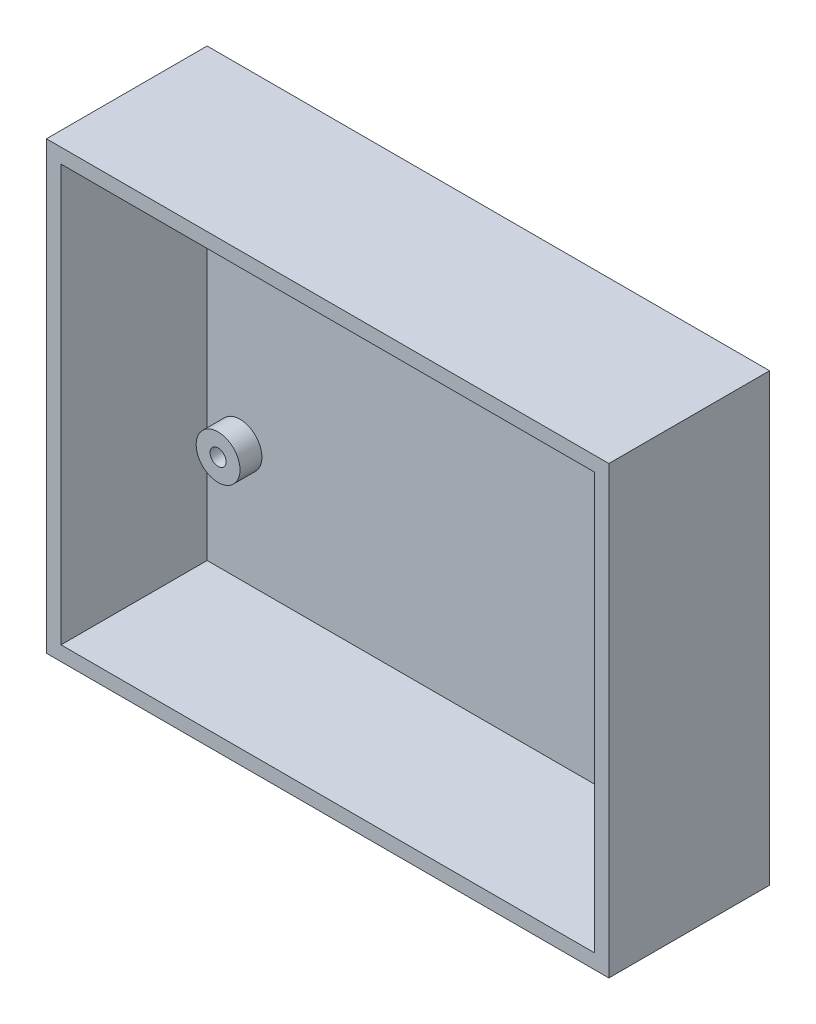
ISO-10303-21;
HEADER;
FILE_DESCRIPTION(('STEP AP214'),'2;1');
FILE_NAME('part.step','',(''),(''),'','','');
FILE_SCHEMA(('AUTOMOTIVE_DESIGN { 1 0 10303 214 1 1 1 1 }'));
ENDSEC;
DATA;
#1=APPLICATION_CONTEXT('core data for automotive mechanical design processes');
#2=APPLICATION_PROTOCOL_DEFINITION('international standard','automotive_design',2000,#1);
#3=PRODUCT_CONTEXT('',#1,'mechanical');
#4=PRODUCT('Part','Part','',(#3));
#5=PRODUCT_RELATED_PRODUCT_CATEGORY('part','',(#4));
#6=PRODUCT_DEFINITION_FORMATION('','',#4);
#7=PRODUCT_DEFINITION_CONTEXT('part definition',#1,'design');
#8=PRODUCT_DEFINITION('design','',#6,#7);
#9=PRODUCT_DEFINITION_SHAPE('','',#8);
#10=(LENGTH_UNIT() NAMED_UNIT(*) SI_UNIT(.MILLI.,.METRE.));
#11=(NAMED_UNIT(*) PLANE_ANGLE_UNIT() SI_UNIT($,.RADIAN.));
#12=(NAMED_UNIT(*) SI_UNIT($,.STERADIAN.) SOLID_ANGLE_UNIT());
#13=UNCERTAINTY_MEASURE_WITH_UNIT(LENGTH_MEASURE(1.E-05),#10,'distance_accuracy_value','');
#14=(GEOMETRIC_REPRESENTATION_CONTEXT(3) GLOBAL_UNCERTAINTY_ASSIGNED_CONTEXT((#13)) GLOBAL_UNIT_ASSIGNED_CONTEXT((#10,
#11,#12)) REPRESENTATION_CONTEXT('',''));
#15=CARTESIAN_POINT('',(0.,0.,0.));
#16=DIRECTION('',(0.,0.,1.));
#17=DIRECTION('',(1.,0.,0.));
#18=AXIS2_PLACEMENT_3D('',#15,#16,#17);
#19=CARTESIAN_POINT('',(2.,2.,22.));
#20=DIRECTION('',(1.,0.,0.));
#21=DIRECTION('',(0.,0.,-1.));
#22=AXIS2_PLACEMENT_3D('',#19,#20,#21);
#23=PLANE('',#22);
#24=DIRECTION('',(0.,0.,-1.));
#25=VECTOR('',#24,1.);
#26=CARTESIAN_POINT('',(2.,2.,22.));
#27=LINE('',#26,#25);
#28=CARTESIAN_POINT('',(2.,2.,22.));
#29=VERTEX_POINT('',#28);
#30=CARTESIAN_POINT('',(2.,2.,2.));
#31=VERTEX_POINT('',#30);
#32=EDGE_CURVE('E118',#29,#31,#27,.T.);
#33=ORIENTED_EDGE('',*,*,#32,.T.);
#34=DIRECTION('',(0.,1.,0.));
#35=VECTOR('',#34,1.);
#36=CARTESIAN_POINT('',(2.,2.,2.));
#37=LINE('',#36,#35);
#38=CARTESIAN_POINT('',(2.,59.,2.));
#39=VERTEX_POINT('',#38);
#40=EDGE_CURVE('E106',#31,#39,#37,.T.);
#41=ORIENTED_EDGE('',*,*,#40,.T.);
#42=DIRECTION('',(0.,0.,-1.));
#43=VECTOR('',#42,1.);
#44=CARTESIAN_POINT('',(2.,59.,22.));
#45=LINE('',#44,#43);
#46=CARTESIAN_POINT('',(2.,59.,22.));
#47=VERTEX_POINT('',#46);
#48=EDGE_CURVE('E115',#47,#39,#45,.T.);
#49=ORIENTED_EDGE('',*,*,#48,.F.);
#50=DIRECTION('',(0.,-1.,0.));
#51=VECTOR('',#50,1.);
#52=CARTESIAN_POINT('',(2.,2.,22.));
#53=LINE('',#52,#51);
#54=EDGE_CURVE('E119',#47,#29,#53,.T.);
#55=ORIENTED_EDGE('',*,*,#54,.T.);
#56=EDGE_LOOP('',(#33,#41,#49,#55));
#57=FACE_BOUND('',#56,.T.);
#58=ADVANCED_FACE('F39',(#57),#23,.T.);
#59=CARTESIAN_POINT('',(2.,2.,22.));
#60=DIRECTION('',(0.,1.,0.));
#61=DIRECTION('',(0.,0.,1.));
#62=AXIS2_PLACEMENT_3D('',#59,#60,#61);
#63=PLANE('',#62);
#64=DIRECTION('',(0.,0.,-1.));
#65=VECTOR('',#64,1.);
#66=CARTESIAN_POINT('',(75.,2.,22.));
#67=LINE('',#66,#65);
#68=CARTESIAN_POINT('',(75.,2.,22.));
#69=VERTEX_POINT('',#68);
#70=CARTESIAN_POINT('',(75.,2.,2.));
#71=VERTEX_POINT('',#70);
#72=EDGE_CURVE('E126',#69,#71,#67,.T.);
#73=ORIENTED_EDGE('',*,*,#72,.T.);
#74=DIRECTION('',(-1.,0.,0.));
#75=VECTOR('',#74,1.);
#76=CARTESIAN_POINT('',(2.,2.,2.));
#77=LINE('',#76,#75);
#78=EDGE_CURVE('E120',#71,#31,#77,.T.);
#79=ORIENTED_EDGE('',*,*,#78,.T.);
#80=ORIENTED_EDGE('',*,*,#32,.F.);
#81=DIRECTION('',(1.,0.,0.));
#82=VECTOR('',#81,1.);
#83=CARTESIAN_POINT('',(2.,2.,22.));
#84=LINE('',#83,#82);
#85=EDGE_CURVE('E203',#29,#69,#84,.T.);
#86=ORIENTED_EDGE('',*,*,#85,.T.);
#87=EDGE_LOOP('',(#73,#79,#80,#86));
#88=FACE_BOUND('',#87,.T.);
#89=ADVANCED_FACE('F212',(#88),#63,.T.);
#90=CARTESIAN_POINT('',(75.,2.,22.));
#91=DIRECTION('',(-1.,0.,0.));
#92=DIRECTION('',(0.,0.,1.));
#93=AXIS2_PLACEMENT_3D('',#90,#91,#92);
#94=PLANE('',#93);
#95=DIRECTION('',(0.,0.,-1.));
#96=VECTOR('',#95,1.);
#97=CARTESIAN_POINT('',(75.,59.,22.));
#98=LINE('',#97,#96);
#99=CARTESIAN_POINT('',(75.,59.,22.));
#100=VERTEX_POINT('',#99);
#101=CARTESIAN_POINT('',(75.,59.,2.));
#102=VERTEX_POINT('',#101);
#103=EDGE_CURVE('E63',#100,#102,#98,.T.);
#104=ORIENTED_EDGE('',*,*,#103,.T.);
#105=DIRECTION('',(0.,-1.,0.));
#106=VECTOR('',#105,1.);
#107=CARTESIAN_POINT('',(75.,2.,2.));
#108=LINE('',#107,#106);
#109=EDGE_CURVE('E56',#102,#71,#108,.T.);
#110=ORIENTED_EDGE('',*,*,#109,.T.);
#111=ORIENTED_EDGE('',*,*,#72,.F.);
#112=DIRECTION('',(0.,1.,0.));
#113=VECTOR('',#112,1.);
#114=CARTESIAN_POINT('',(75.,2.,22.));
#115=LINE('',#114,#113);
#116=EDGE_CURVE('E128',#69,#100,#115,.T.);
#117=ORIENTED_EDGE('',*,*,#116,.T.);
#118=EDGE_LOOP('',(#104,#110,#111,#117));
#119=FACE_BOUND('',#118,.T.);
#120=ADVANCED_FACE('F207',(#119),#94,.T.);
#121=CARTESIAN_POINT('',(2.,59.,22.));
#122=DIRECTION('',(0.,-1.,0.));
#123=DIRECTION('',(0.,0.,-1.));
#124=AXIS2_PLACEMENT_3D('',#121,#122,#123);
#125=PLANE('',#124);
#126=ORIENTED_EDGE('',*,*,#48,.T.);
#127=DIRECTION('',(1.,0.,0.));
#128=VECTOR('',#127,1.);
#129=CARTESIAN_POINT('',(2.,59.,2.));
#130=LINE('',#129,#128);
#131=EDGE_CURVE('E103',#39,#102,#130,.T.);
#132=ORIENTED_EDGE('',*,*,#131,.T.);
#133=ORIENTED_EDGE('',*,*,#103,.F.);
#134=DIRECTION('',(-1.,0.,0.));
#135=VECTOR('',#134,1.);
#136=CARTESIAN_POINT('',(2.,59.,22.));
#137=LINE('',#136,#135);
#138=EDGE_CURVE('E124',#100,#47,#137,.T.);
#139=ORIENTED_EDGE('',*,*,#138,.T.);
#140=EDGE_LOOP('',(#126,#132,#133,#139));
#141=FACE_BOUND('',#140,.T.);
#142=ADVANCED_FACE('F122',(#141),#125,.T.);
#143=CARTESIAN_POINT('',(0.,0.,22.));
#144=DIRECTION('',(0.,0.,-1.));
#145=DIRECTION('',(-1.,0.,0.));
#146=AXIS2_PLACEMENT_3D('',#143,#144,#145);
#147=PLANE('',#146);
#148=DIRECTION('',(0.,-1.,0.));
#149=VECTOR('',#148,1.);
#150=CARTESIAN_POINT('',(0.,0.,22.));
#151=LINE('',#150,#149);
#152=CARTESIAN_POINT('',(0.,61.,22.));
#153=VERTEX_POINT('',#152);
#154=CARTESIAN_POINT('',(0.,0.,22.));
#155=VERTEX_POINT('',#154);
#156=EDGE_CURVE('E136',#153,#155,#151,.T.);
#157=ORIENTED_EDGE('',*,*,#156,.T.);
#158=DIRECTION('',(1.,0.,0.));
#159=VECTOR('',#158,1.);
#160=CARTESIAN_POINT('',(0.,0.,22.));
#161=LINE('',#160,#159);
#162=CARTESIAN_POINT('',(77.,0.,22.));
#163=VERTEX_POINT('',#162);
#164=EDGE_CURVE('E139',#155,#163,#161,.T.);
#165=ORIENTED_EDGE('',*,*,#164,.T.);
#166=DIRECTION('',(0.,1.,0.));
#167=VECTOR('',#166,1.);
#168=CARTESIAN_POINT('',(77.,0.,22.));
#169=LINE('',#168,#167);
#170=CARTESIAN_POINT('',(77.,61.,22.));
#171=VERTEX_POINT('',#170);
#172=EDGE_CURVE('E142',#163,#171,#169,.T.);
#173=ORIENTED_EDGE('',*,*,#172,.T.);
#174=DIRECTION('',(-1.,0.,0.));
#175=VECTOR('',#174,1.);
#176=CARTESIAN_POINT('',(0.,61.,22.));
#177=LINE('',#176,#175);
#178=EDGE_CURVE('E144',#171,#153,#177,.T.);
#179=ORIENTED_EDGE('',*,*,#178,.T.);
#180=EDGE_LOOP('',(#157,#165,#173,#179));
#181=FACE_BOUND('',#180,.T.);
#182=ORIENTED_EDGE('',*,*,#54,.F.);
#183=ORIENTED_EDGE('',*,*,#138,.F.);
#184=ORIENTED_EDGE('',*,*,#116,.F.);
#185=ORIENTED_EDGE('',*,*,#85,.F.);
#186=EDGE_LOOP('',(#182,#183,#184,#185));
#187=FACE_BOUND('',#186,.T.);
#188=ADVANCED_FACE('F210',(#181,#187),#147,.F.);
#189=CARTESIAN_POINT('',(0.,0.,0.));
#190=DIRECTION('',(0.,0.,-1.));
#191=DIRECTION('',(-1.,0.,0.));
#192=AXIS2_PLACEMENT_3D('',#189,#190,#191);
#193=PLANE('',#192);
#194=CARTESIAN_POINT('',(70.5,18.,0.));
#195=DIRECTION('',(0.,0.,1.));
#196=DIRECTION('',(1.,0.,0.));
#197=AXIS2_PLACEMENT_3D('',#194,#195,#196);
#198=CIRCLE('',#197,1.10000000000001);
#199=CARTESIAN_POINT('',(71.6,18.,0.));
#200=VERTEX_POINT('',#199);
#201=EDGE_CURVE('E493',#200,#200,#198,.T.);
#202=ORIENTED_EDGE('',*,*,#201,.T.);
#203=EDGE_LOOP('',(#202));
#204=FACE_BOUND('',#203,.T.);
#205=CARTESIAN_POINT('',(6.5,54.,0.));
#206=DIRECTION('',(0.,0.,1.));
#207=DIRECTION('',(1.,0.,0.));
#208=AXIS2_PLACEMENT_3D('',#205,#206,#207);
#209=CIRCLE('',#208,1.1);
#210=CARTESIAN_POINT('',(7.6,54.,0.));
#211=VERTEX_POINT('',#210);
#212=EDGE_CURVE('E495',#211,#211,#209,.T.);
#213=ORIENTED_EDGE('',*,*,#212,.T.);
#214=EDGE_LOOP('',(#213));
#215=FACE_BOUND('',#214,.T.);
#216=CARTESIAN_POINT('',(70.5,54.,0.));
#217=DIRECTION('',(0.,0.,1.));
#218=DIRECTION('',(1.,0.,0.));
#219=AXIS2_PLACEMENT_3D('',#216,#217,#218);
#220=CIRCLE('',#219,1.10000000000001);
#221=CARTESIAN_POINT('',(71.6,54.,0.));
#222=VERTEX_POINT('',#221);
#223=EDGE_CURVE('E499',#222,#222,#220,.T.);
#224=ORIENTED_EDGE('',*,*,#223,.T.);
#225=EDGE_LOOP('',(#224));
#226=FACE_BOUND('',#225,.T.);
#227=CARTESIAN_POINT('',(6.5,18.,0.));
#228=DIRECTION('',(0.,0.,1.));
#229=DIRECTION('',(1.,0.,0.));
#230=AXIS2_PLACEMENT_3D('',#227,#228,#229);
#231=CIRCLE('',#230,1.1);
#232=CARTESIAN_POINT('',(7.6,18.,0.));
#233=VERTEX_POINT('',#232);
#234=EDGE_CURVE('E174',#233,#233,#231,.T.);
#235=ORIENTED_EDGE('',*,*,#234,.T.);
#236=EDGE_LOOP('',(#235));
#237=FACE_BOUND('',#236,.T.);
#238=DIRECTION('',(0.,-1.,0.));
#239=VECTOR('',#238,1.);
#240=CARTESIAN_POINT('',(0.,0.,0.));
#241=LINE('',#240,#239);
#242=CARTESIAN_POINT('',(0.,61.,0.));
#243=VERTEX_POINT('',#242);
#244=CARTESIAN_POINT('',(0.,0.,0.));
#245=VERTEX_POINT('',#244);
#246=EDGE_CURVE('E135',#243,#245,#241,.T.);
#247=ORIENTED_EDGE('',*,*,#246,.F.);
#248=DIRECTION('',(-1.,0.,0.));
#249=VECTOR('',#248,1.);
#250=CARTESIAN_POINT('',(0.,61.,0.));
#251=LINE('',#250,#249);
#252=CARTESIAN_POINT('',(77.,61.,0.));
#253=VERTEX_POINT('',#252);
#254=EDGE_CURVE('E140',#253,#243,#251,.T.);
#255=ORIENTED_EDGE('',*,*,#254,.F.);
#256=DIRECTION('',(0.,1.,0.));
#257=VECTOR('',#256,1.);
#258=CARTESIAN_POINT('',(77.,0.,0.));
#259=LINE('',#258,#257);
#260=CARTESIAN_POINT('',(77.,0.,0.));
#261=VERTEX_POINT('',#260);
#262=EDGE_CURVE('E152',#261,#253,#259,.T.);
#263=ORIENTED_EDGE('',*,*,#262,.F.);
#264=DIRECTION('',(1.,0.,0.));
#265=VECTOR('',#264,1.);
#266=CARTESIAN_POINT('',(0.,0.,0.));
#267=LINE('',#266,#265);
#268=EDGE_CURVE('E149',#245,#261,#267,.T.);
#269=ORIENTED_EDGE('',*,*,#268,.F.);
#270=EDGE_LOOP('',(#247,#255,#263,#269));
#271=FACE_BOUND('',#270,.T.);
#272=ADVANCED_FACE('F225',(#204,#215,#226,#237,#271),#193,.T.);
#273=CARTESIAN_POINT('',(0.,0.,22.));
#274=DIRECTION('',(1.,0.,0.));
#275=DIRECTION('',(0.,0.,-1.));
#276=AXIS2_PLACEMENT_3D('',#273,#274,#275);
#277=PLANE('',#276);
#278=ORIENTED_EDGE('',*,*,#246,.T.);
#279=DIRECTION('',(0.,0.,-1.));
#280=VECTOR('',#279,1.);
#281=CARTESIAN_POINT('',(0.,0.,22.));
#282=LINE('',#281,#280);
#283=EDGE_CURVE('E110',#155,#245,#282,.T.);
#284=ORIENTED_EDGE('',*,*,#283,.F.);
#285=ORIENTED_EDGE('',*,*,#156,.F.);
#286=DIRECTION('',(0.,0.,-1.));
#287=VECTOR('',#286,1.);
#288=CARTESIAN_POINT('',(0.,61.,22.));
#289=LINE('',#288,#287);
#290=EDGE_CURVE('E146',#153,#243,#289,.T.);
#291=ORIENTED_EDGE('',*,*,#290,.T.);
#292=EDGE_LOOP('',(#278,#284,#285,#291));
#293=FACE_BOUND('',#292,.T.);
#294=ADVANCED_FACE('F41',(#293),#277,.F.);
#295=CARTESIAN_POINT('',(0.,0.,22.));
#296=DIRECTION('',(0.,1.,0.));
#297=DIRECTION('',(0.,0.,1.));
#298=AXIS2_PLACEMENT_3D('',#295,#296,#297);
#299=PLANE('',#298);
#300=ORIENTED_EDGE('',*,*,#268,.T.);
#301=DIRECTION('',(0.,0.,-1.));
#302=VECTOR('',#301,1.);
#303=CARTESIAN_POINT('',(77.,0.,22.));
#304=LINE('',#303,#302);
#305=EDGE_CURVE('E160',#163,#261,#304,.T.);
#306=ORIENTED_EDGE('',*,*,#305,.F.);
#307=ORIENTED_EDGE('',*,*,#164,.F.);
#308=ORIENTED_EDGE('',*,*,#283,.T.);
#309=EDGE_LOOP('',(#300,#306,#307,#308));
#310=FACE_BOUND('',#309,.T.);
#311=ADVANCED_FACE('F236',(#310),#299,.F.);
#312=CARTESIAN_POINT('',(77.,0.,22.));
#313=DIRECTION('',(-1.,0.,0.));
#314=DIRECTION('',(0.,0.,1.));
#315=AXIS2_PLACEMENT_3D('',#312,#313,#314);
#316=PLANE('',#315);
#317=ORIENTED_EDGE('',*,*,#262,.T.);
#318=DIRECTION('',(0.,0.,-1.));
#319=VECTOR('',#318,1.);
#320=CARTESIAN_POINT('',(77.,61.,22.));
#321=LINE('',#320,#319);
#322=EDGE_CURVE('E158',#171,#253,#321,.T.);
#323=ORIENTED_EDGE('',*,*,#322,.F.);
#324=ORIENTED_EDGE('',*,*,#172,.F.);
#325=ORIENTED_EDGE('',*,*,#305,.T.);
#326=EDGE_LOOP('',(#317,#323,#324,#325));
#327=FACE_BOUND('',#326,.T.);
#328=ADVANCED_FACE('F233',(#327),#316,.F.);
#329=CARTESIAN_POINT('',(0.,61.,22.));
#330=DIRECTION('',(0.,-1.,0.));
#331=DIRECTION('',(0.,0.,-1.));
#332=AXIS2_PLACEMENT_3D('',#329,#330,#331);
#333=PLANE('',#332);
#334=ORIENTED_EDGE('',*,*,#254,.T.);
#335=ORIENTED_EDGE('',*,*,#290,.F.);
#336=ORIENTED_EDGE('',*,*,#178,.F.);
#337=ORIENTED_EDGE('',*,*,#322,.T.);
#338=EDGE_LOOP('',(#334,#335,#336,#337));
#339=FACE_BOUND('',#338,.T.);
#340=ADVANCED_FACE('F230',(#339),#333,.F.);
#341=CARTESIAN_POINT('',(0.,0.,2.));
#342=DIRECTION('',(0.,0.,-1.));
#343=DIRECTION('',(-1.,0.,0.));
#344=AXIS2_PLACEMENT_3D('',#341,#342,#343);
#345=PLANE('',#344);
#346=CARTESIAN_POINT('',(70.5,54.,2.));
#347=DIRECTION('',(0.,0.,-1.));
#348=DIRECTION('',(-1.,0.,0.));
#349=AXIS2_PLACEMENT_3D('',#346,#347,#348);
#350=CIRCLE('',#349,3.00000000000001);
#351=CARTESIAN_POINT('',(67.5,54.,2.));
#352=VERTEX_POINT('',#351);
#353=EDGE_CURVE('E11',#352,#352,#350,.F.);
#354=ORIENTED_EDGE('',*,*,#353,.F.);
#355=EDGE_LOOP('',(#354));
#356=FACE_BOUND('',#355,.T.);
#357=CARTESIAN_POINT('',(6.5,54.,2.));
#358=DIRECTION('',(0.,0.,-1.));
#359=DIRECTION('',(-1.,0.,0.));
#360=AXIS2_PLACEMENT_3D('',#357,#358,#359);
#361=CIRCLE('',#360,3.);
#362=CARTESIAN_POINT('',(3.5,54.,2.));
#363=VERTEX_POINT('',#362);
#364=EDGE_CURVE('E48',#363,#363,#361,.F.);
#365=ORIENTED_EDGE('',*,*,#364,.F.);
#366=EDGE_LOOP('',(#365));
#367=FACE_BOUND('',#366,.T.);
#368=CARTESIAN_POINT('',(70.5,18.,2.));
#369=DIRECTION('',(0.,0.,-1.));
#370=DIRECTION('',(-1.,0.,0.));
#371=AXIS2_PLACEMENT_3D('',#368,#369,#370);
#372=CIRCLE('',#371,3.00000000000001);
#373=CARTESIAN_POINT('',(67.5,18.,2.));
#374=VERTEX_POINT('',#373);
#375=EDGE_CURVE('E165',#374,#374,#372,.F.);
#376=ORIENTED_EDGE('',*,*,#375,.F.);
#377=EDGE_LOOP('',(#376));
#378=FACE_BOUND('',#377,.T.);
#379=CARTESIAN_POINT('',(6.5,18.,2.));
#380=DIRECTION('',(0.,0.,-1.));
#381=DIRECTION('',(-1.,0.,0.));
#382=AXIS2_PLACEMENT_3D('',#379,#380,#381);
#383=CIRCLE('',#382,3.);
#384=CARTESIAN_POINT('',(3.5,18.,2.));
#385=VERTEX_POINT('',#384);
#386=EDGE_CURVE('E109',#385,#385,#383,.F.);
#387=ORIENTED_EDGE('',*,*,#386,.F.);
#388=EDGE_LOOP('',(#387));
#389=FACE_BOUND('',#388,.T.);
#390=ORIENTED_EDGE('',*,*,#40,.F.);
#391=ORIENTED_EDGE('',*,*,#78,.F.);
#392=ORIENTED_EDGE('',*,*,#109,.F.);
#393=ORIENTED_EDGE('',*,*,#131,.F.);
#394=EDGE_LOOP('',(#390,#391,#392,#393));
#395=FACE_BOUND('',#394,.T.);
#396=ADVANCED_FACE('F105',(#356,#367,#378,#389,#395),#345,.F.);
#397=CARTESIAN_POINT('',(6.5,18.,5.));
#398=DIRECTION('',(0.,0.,-1.));
#399=DIRECTION('',(-1.,0.,0.));
#400=AXIS2_PLACEMENT_3D('',#397,#398,#399);
#401=CYLINDRICAL_SURFACE('',#400,3.);
#402=CARTESIAN_POINT('',(6.5,18.,5.));
#403=DIRECTION('',(0.,0.,1.));
#404=DIRECTION('',(1.,0.,0.));
#405=AXIS2_PLACEMENT_3D('',#402,#403,#404);
#406=CIRCLE('',#405,3.);
#407=CARTESIAN_POINT('',(9.5,18.,5.));
#408=VERTEX_POINT('',#407);
#409=EDGE_CURVE('E197',#408,#408,#406,.T.);
#410=ORIENTED_EDGE('',*,*,#409,.F.);
#411=EDGE_LOOP('',(#410));
#412=FACE_BOUND('',#411,.T.);
#413=ORIENTED_EDGE('',*,*,#386,.T.);
#414=EDGE_LOOP('',(#413));
#415=FACE_BOUND('',#414,.T.);
#416=ADVANCED_FACE('F298',(#412,#415),#401,.T.);
#417=CARTESIAN_POINT('',(6.5,18.,5.));
#418=DIRECTION('',(0.,0.,1.));
#419=DIRECTION('',(1.,0.,0.));
#420=AXIS2_PLACEMENT_3D('',#417,#418,#419);
#421=PLANE('',#420);
#422=CARTESIAN_POINT('',(6.5,18.,5.));
#423=DIRECTION('',(0.,0.,1.));
#424=DIRECTION('',(1.,0.,0.));
#425=AXIS2_PLACEMENT_3D('',#422,#423,#424);
#426=CIRCLE('',#425,1.1);
#427=CARTESIAN_POINT('',(7.6,18.,5.));
#428=VERTEX_POINT('',#427);
#429=EDGE_CURVE('E43',#428,#428,#426,.F.);
#430=ORIENTED_EDGE('',*,*,#429,.T.);
#431=EDGE_LOOP('',(#430));
#432=FACE_BOUND('',#431,.T.);
#433=ORIENTED_EDGE('',*,*,#409,.T.);
#434=EDGE_LOOP('',(#433));
#435=FACE_BOUND('',#434,.T.);
#436=ADVANCED_FACE('F308',(#432,#435),#421,.T.);
#437=CARTESIAN_POINT('',(70.5,18.,5.));
#438=DIRECTION('',(0.,0.,-1.));
#439=DIRECTION('',(-1.,0.,0.));
#440=AXIS2_PLACEMENT_3D('',#437,#438,#439);
#441=CYLINDRICAL_SURFACE('',#440,3.00000000000001);
#442=CARTESIAN_POINT('',(70.5,18.,5.));
#443=DIRECTION('',(0.,0.,1.));
#444=DIRECTION('',(1.,0.,0.));
#445=AXIS2_PLACEMENT_3D('',#442,#443,#444);
#446=CIRCLE('',#445,3.00000000000001);
#447=CARTESIAN_POINT('',(73.5,18.,5.));
#448=VERTEX_POINT('',#447);
#449=EDGE_CURVE('E190',#448,#448,#446,.T.);
#450=ORIENTED_EDGE('',*,*,#449,.F.);
#451=EDGE_LOOP('',(#450));
#452=FACE_BOUND('',#451,.T.);
#453=ORIENTED_EDGE('',*,*,#375,.T.);
#454=EDGE_LOOP('',(#453));
#455=FACE_BOUND('',#454,.T.);
#456=ADVANCED_FACE('F318',(#452,#455),#441,.T.);
#457=CARTESIAN_POINT('',(70.5,18.,5.));
#458=DIRECTION('',(0.,0.,1.));
#459=DIRECTION('',(1.,0.,0.));
#460=AXIS2_PLACEMENT_3D('',#457,#458,#459);
#461=PLANE('',#460);
#462=CARTESIAN_POINT('',(70.5,18.,5.));
#463=DIRECTION('',(0.,0.,1.));
#464=DIRECTION('',(1.,0.,0.));
#465=AXIS2_PLACEMENT_3D('',#462,#463,#464);
#466=CIRCLE('',#465,1.10000000000001);
#467=CARTESIAN_POINT('',(71.6,18.,5.));
#468=VERTEX_POINT('',#467);
#469=EDGE_CURVE('E176',#468,#468,#466,.F.);
#470=ORIENTED_EDGE('',*,*,#469,.T.);
#471=EDGE_LOOP('',(#470));
#472=FACE_BOUND('',#471,.T.);
#473=ORIENTED_EDGE('',*,*,#449,.T.);
#474=EDGE_LOOP('',(#473));
#475=FACE_BOUND('',#474,.T.);
#476=ADVANCED_FACE('F326',(#472,#475),#461,.T.);
#477=CARTESIAN_POINT('',(6.5,54.,5.));
#478=DIRECTION('',(0.,0.,-1.));
#479=DIRECTION('',(-1.,0.,0.));
#480=AXIS2_PLACEMENT_3D('',#477,#478,#479);
#481=CYLINDRICAL_SURFACE('',#480,3.);
#482=CARTESIAN_POINT('',(6.5,54.,5.));
#483=DIRECTION('',(0.,0.,1.));
#484=DIRECTION('',(1.,0.,0.));
#485=AXIS2_PLACEMENT_3D('',#482,#483,#484);
#486=CIRCLE('',#485,3.);
#487=CARTESIAN_POINT('',(9.5,54.,5.));
#488=VERTEX_POINT('',#487);
#489=EDGE_CURVE('E185',#488,#488,#486,.T.);
#490=ORIENTED_EDGE('',*,*,#489,.F.);
#491=EDGE_LOOP('',(#490));
#492=FACE_BOUND('',#491,.T.);
#493=ORIENTED_EDGE('',*,*,#364,.T.);
#494=EDGE_LOOP('',(#493));
#495=FACE_BOUND('',#494,.T.);
#496=ADVANCED_FACE('F336',(#492,#495),#481,.T.);
#497=CARTESIAN_POINT('',(6.5,54.,5.));
#498=DIRECTION('',(0.,0.,1.));
#499=DIRECTION('',(1.,0.,0.));
#500=AXIS2_PLACEMENT_3D('',#497,#498,#499);
#501=PLANE('',#500);
#502=CARTESIAN_POINT('',(6.5,54.,5.));
#503=DIRECTION('',(0.,0.,1.));
#504=DIRECTION('',(1.,0.,0.));
#505=AXIS2_PLACEMENT_3D('',#502,#503,#504);
#506=CIRCLE('',#505,1.1);
#507=CARTESIAN_POINT('',(7.6,54.,5.));
#508=VERTEX_POINT('',#507);
#509=EDGE_CURVE('E173',#508,#508,#506,.F.);
#510=ORIENTED_EDGE('',*,*,#509,.T.);
#511=EDGE_LOOP('',(#510));
#512=FACE_BOUND('',#511,.T.);
#513=ORIENTED_EDGE('',*,*,#489,.T.);
#514=EDGE_LOOP('',(#513));
#515=FACE_BOUND('',#514,.T.);
#516=ADVANCED_FACE('F345',(#512,#515),#501,.T.);
#517=CARTESIAN_POINT('',(70.5,54.,5.));
#518=DIRECTION('',(0.,0.,-1.));
#519=DIRECTION('',(-1.,0.,0.));
#520=AXIS2_PLACEMENT_3D('',#517,#518,#519);
#521=CYLINDRICAL_SURFACE('',#520,3.00000000000001);
#522=CARTESIAN_POINT('',(70.5,54.,5.));
#523=DIRECTION('',(0.,0.,1.));
#524=DIRECTION('',(1.,0.,0.));
#525=AXIS2_PLACEMENT_3D('',#522,#523,#524);
#526=CIRCLE('',#525,3.00000000000001);
#527=CARTESIAN_POINT('',(73.5,54.,5.));
#528=VERTEX_POINT('',#527);
#529=EDGE_CURVE('E181',#528,#528,#526,.T.);
#530=ORIENTED_EDGE('',*,*,#529,.F.);
#531=EDGE_LOOP('',(#530));
#532=FACE_BOUND('',#531,.T.);
#533=ORIENTED_EDGE('',*,*,#353,.T.);
#534=EDGE_LOOP('',(#533));
#535=FACE_BOUND('',#534,.T.);
#536=ADVANCED_FACE('F355',(#532,#535),#521,.T.);
#537=CARTESIAN_POINT('',(70.5,54.,5.));
#538=DIRECTION('',(0.,0.,1.));
#539=DIRECTION('',(1.,0.,0.));
#540=AXIS2_PLACEMENT_3D('',#537,#538,#539);
#541=PLANE('',#540);
#542=CARTESIAN_POINT('',(70.5,54.,5.));
#543=DIRECTION('',(0.,0.,1.));
#544=DIRECTION('',(1.,0.,0.));
#545=AXIS2_PLACEMENT_3D('',#542,#543,#544);
#546=CIRCLE('',#545,1.10000000000001);
#547=CARTESIAN_POINT('',(71.6,54.,5.));
#548=VERTEX_POINT('',#547);
#549=EDGE_CURVE('E170',#548,#548,#546,.F.);
#550=ORIENTED_EDGE('',*,*,#549,.T.);
#551=EDGE_LOOP('',(#550));
#552=FACE_BOUND('',#551,.T.);
#553=ORIENTED_EDGE('',*,*,#529,.T.);
#554=EDGE_LOOP('',(#553));
#555=FACE_BOUND('',#554,.T.);
#556=ADVANCED_FACE('F365',(#552,#555),#541,.T.);
#557=CARTESIAN_POINT('',(70.5,54.,22.));
#558=DIRECTION('',(0.,0.,-1.));
#559=DIRECTION('',(-1.,0.,0.));
#560=AXIS2_PLACEMENT_3D('',#557,#558,#559);
#561=CYLINDRICAL_SURFACE('',#560,1.10000000000001);
#562=ORIENTED_EDGE('',*,*,#549,.F.);
#563=EDGE_LOOP('',(#562));
#564=FACE_BOUND('',#563,.T.);
#565=ORIENTED_EDGE('',*,*,#223,.F.);
#566=EDGE_LOOP('',(#565));
#567=FACE_BOUND('',#566,.T.);
#568=ADVANCED_FACE('F374',(#564,#567),#561,.F.);
#569=CARTESIAN_POINT('',(6.5,54.,22.));
#570=DIRECTION('',(0.,0.,-1.));
#571=DIRECTION('',(-1.,0.,0.));
#572=AXIS2_PLACEMENT_3D('',#569,#570,#571);
#573=CYLINDRICAL_SURFACE('',#572,1.1);
#574=ORIENTED_EDGE('',*,*,#509,.F.);
#575=EDGE_LOOP('',(#574));
#576=FACE_BOUND('',#575,.T.);
#577=ORIENTED_EDGE('',*,*,#212,.F.);
#578=EDGE_LOOP('',(#577));
#579=FACE_BOUND('',#578,.T.);
#580=ADVANCED_FACE('F384',(#576,#579),#573,.F.);
#581=CARTESIAN_POINT('',(70.5,18.,22.));
#582=DIRECTION('',(0.,0.,-1.));
#583=DIRECTION('',(-1.,0.,0.));
#584=AXIS2_PLACEMENT_3D('',#581,#582,#583);
#585=CYLINDRICAL_SURFACE('',#584,1.10000000000001);
#586=ORIENTED_EDGE('',*,*,#469,.F.);
#587=EDGE_LOOP('',(#586));
#588=FACE_BOUND('',#587,.T.);
#589=ORIENTED_EDGE('',*,*,#201,.F.);
#590=EDGE_LOOP('',(#589));
#591=FACE_BOUND('',#590,.T.);
#592=ADVANCED_FACE('F394',(#588,#591),#585,.F.);
#593=CARTESIAN_POINT('',(6.5,18.,22.));
#594=DIRECTION('',(0.,0.,-1.));
#595=DIRECTION('',(-1.,0.,0.));
#596=AXIS2_PLACEMENT_3D('',#593,#594,#595);
#597=CYLINDRICAL_SURFACE('',#596,1.1);
#598=ORIENTED_EDGE('',*,*,#429,.F.);
#599=EDGE_LOOP('',(#598));
#600=FACE_BOUND('',#599,.T.);
#601=ORIENTED_EDGE('',*,*,#234,.F.);
#602=EDGE_LOOP('',(#601));
#603=FACE_BOUND('',#602,.T.);
#604=ADVANCED_FACE('F404',(#600,#603),#597,.F.);
#605=CLOSED_SHELL('',(#58,#89,#120,#142,#188,#272,#294,#311,#328,#340,#396,#416,#436,#456,#476,
#496,#516,#536,#556,#568,#580,#592,#604));
#606=MANIFOLD_SOLID_BREP('B2',#605);
#607=ADVANCED_BREP_SHAPE_REPRESENTATION('',(#18,#606),#14);
#608=SHAPE_DEFINITION_REPRESENTATION(#9,#607);
ENDSEC;
END-ISO-10303-21;
